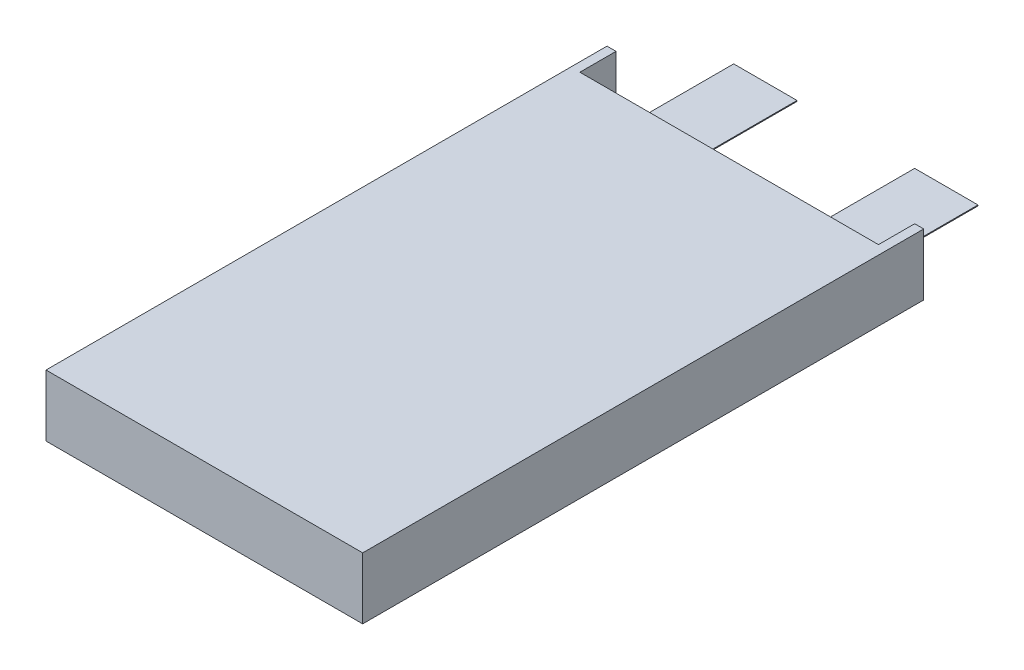
ISO-10303-21;
HEADER;
FILE_DESCRIPTION(('STEP AP214'),'2;1');
FILE_NAME('part.step','',(''),(''),'','','');
FILE_SCHEMA(('AUTOMOTIVE_DESIGN { 1 0 10303 214 1 1 1 1 }'));
ENDSEC;
DATA;
#1=APPLICATION_CONTEXT('core data for automotive mechanical design processes');
#2=APPLICATION_PROTOCOL_DEFINITION('international standard','automotive_design',2000,#1);
#3=PRODUCT_CONTEXT('',#1,'mechanical');
#4=PRODUCT('Part','Part','',(#3));
#5=PRODUCT_RELATED_PRODUCT_CATEGORY('part','',(#4));
#6=PRODUCT_DEFINITION_FORMATION('','',#4);
#7=PRODUCT_DEFINITION_CONTEXT('part definition',#1,'design');
#8=PRODUCT_DEFINITION('design','',#6,#7);
#9=PRODUCT_DEFINITION_SHAPE('','',#8);
#10=(LENGTH_UNIT() NAMED_UNIT(*) SI_UNIT(.MILLI.,.METRE.));
#11=(NAMED_UNIT(*) PLANE_ANGLE_UNIT() SI_UNIT($,.RADIAN.));
#12=(NAMED_UNIT(*) SI_UNIT($,.STERADIAN.) SOLID_ANGLE_UNIT());
#13=UNCERTAINTY_MEASURE_WITH_UNIT(LENGTH_MEASURE(1.E-05),#10,'distance_accuracy_value','');
#14=(GEOMETRIC_REPRESENTATION_CONTEXT(3) GLOBAL_UNCERTAINTY_ASSIGNED_CONTEXT((#13)) GLOBAL_UNIT_ASSIGNED_CONTEXT((#10,
#11,#12)) REPRESENTATION_CONTEXT('',''));
#15=CARTESIAN_POINT('',(0.,0.,0.));
#16=DIRECTION('',(0.,0.,1.));
#17=DIRECTION('',(1.,0.,0.));
#18=AXIS2_PLACEMENT_3D('',#15,#16,#17);
#19=CARTESIAN_POINT('',(6.5,2.,-41.));
#20=DIRECTION('',(1.,0.,0.));
#21=DIRECTION('',(0.,0.,-1.));
#22=AXIS2_PLACEMENT_3D('',#19,#20,#21);
#23=PLANE('',#22);
#24=DIRECTION('',(0.,0.,-1.));
#25=VECTOR('',#24,1.);
#26=CARTESIAN_POINT('',(6.5,2.1,-41.));
#27=LINE('',#26,#25);
#28=CARTESIAN_POINT('',(6.5,2.1,-31.));
#29=VERTEX_POINT('',#28);
#30=CARTESIAN_POINT('',(6.5,2.1,-41.));
#31=VERTEX_POINT('',#30);
#32=EDGE_CURVE('E184',#29,#31,#27,.T.);
#33=ORIENTED_EDGE('',*,*,#32,.T.);
#34=DIRECTION('',(0.,1.,0.));
#35=VECTOR('',#34,1.);
#36=CARTESIAN_POINT('',(6.5,2.1,-41.));
#37=LINE('',#36,#35);
#38=CARTESIAN_POINT('',(6.5,2.,-41.));
#39=VERTEX_POINT('',#38);
#40=EDGE_CURVE('E165',#31,#39,#37,.F.);
#41=ORIENTED_EDGE('',*,*,#40,.T.);
#42=DIRECTION('',(0.,0.,1.));
#43=VECTOR('',#42,1.);
#44=CARTESIAN_POINT('',(6.5,2.,-41.));
#45=LINE('',#44,#43);
#46=CARTESIAN_POINT('',(6.5,2.,-31.));
#47=VERTEX_POINT('',#46);
#48=EDGE_CURVE('E180',#39,#47,#45,.T.);
#49=ORIENTED_EDGE('',*,*,#48,.T.);
#50=DIRECTION('',(0.,1.,0.));
#51=VECTOR('',#50,1.);
#52=CARTESIAN_POINT('',(6.5,2.,-31.));
#53=LINE('',#52,#51);
#54=EDGE_CURVE('E19',#29,#47,#53,.F.);
#55=ORIENTED_EDGE('',*,*,#54,.F.);
#56=EDGE_LOOP('',(#33,#41,#49,#55));
#57=FACE_BOUND('',#56,.T.);
#58=ADVANCED_FACE('F16',(#57),#23,.F.);
#59=CARTESIAN_POINT('',(13.5,2.1,-41.));
#60=DIRECTION('',(0.,0.,1.));
#61=DIRECTION('',(1.,0.,0.));
#62=AXIS2_PLACEMENT_3D('',#59,#60,#61);
#63=PLANE('',#62);
#64=DIRECTION('',(1.,0.,0.));
#65=VECTOR('',#64,1.);
#66=CARTESIAN_POINT('',(13.5,2.,-41.));
#67=LINE('',#66,#65);
#68=CARTESIAN_POINT('',(13.5,2.,-41.));
#69=VERTEX_POINT('',#68);
#70=EDGE_CURVE('E185',#69,#39,#67,.F.);
#71=ORIENTED_EDGE('',*,*,#70,.T.);
#72=ORIENTED_EDGE('',*,*,#40,.F.);
#73=DIRECTION('',(1.,0.,0.));
#74=VECTOR('',#73,1.);
#75=CARTESIAN_POINT('',(13.5,2.1,-41.));
#76=LINE('',#75,#74);
#77=CARTESIAN_POINT('',(13.5,2.1,-41.));
#78=VERTEX_POINT('',#77);
#79=EDGE_CURVE('E243',#31,#78,#76,.T.);
#80=ORIENTED_EDGE('',*,*,#79,.T.);
#81=DIRECTION('',(0.,1.,0.));
#82=VECTOR('',#81,1.);
#83=CARTESIAN_POINT('',(13.5,2.,-41.));
#84=LINE('',#83,#82);
#85=EDGE_CURVE('E164',#78,#69,#84,.F.);
#86=ORIENTED_EDGE('',*,*,#85,.T.);
#87=EDGE_LOOP('',(#71,#72,#80,#86));
#88=FACE_BOUND('',#87,.T.);
#89=ADVANCED_FACE('F438',(#88),#63,.F.);
#90=CARTESIAN_POINT('',(13.5,2.,-41.));
#91=DIRECTION('',(-1.,0.,0.));
#92=DIRECTION('',(0.,0.,1.));
#93=AXIS2_PLACEMENT_3D('',#90,#91,#92);
#94=PLANE('',#93);
#95=DIRECTION('',(0.,0.,1.));
#96=VECTOR('',#95,1.);
#97=CARTESIAN_POINT('',(13.5,2.,-41.));
#98=LINE('',#97,#96);
#99=CARTESIAN_POINT('',(13.5,2.,-31.));
#100=VERTEX_POINT('',#99);
#101=EDGE_CURVE('E190',#100,#69,#98,.F.);
#102=ORIENTED_EDGE('',*,*,#101,.T.);
#103=ORIENTED_EDGE('',*,*,#85,.F.);
#104=DIRECTION('',(0.,0.,-1.));
#105=VECTOR('',#104,1.);
#106=CARTESIAN_POINT('',(13.5,2.1,-41.));
#107=LINE('',#106,#105);
#108=CARTESIAN_POINT('',(13.5,2.1,-31.));
#109=VERTEX_POINT('',#108);
#110=EDGE_CURVE('E240',#78,#109,#107,.F.);
#111=ORIENTED_EDGE('',*,*,#110,.T.);
#112=DIRECTION('',(0.,1.,0.));
#113=VECTOR('',#112,1.);
#114=CARTESIAN_POINT('',(13.5,2.,-31.));
#115=LINE('',#114,#113);
#116=EDGE_CURVE('E162',#100,#109,#115,.T.);
#117=ORIENTED_EDGE('',*,*,#116,.F.);
#118=EDGE_LOOP('',(#102,#103,#111,#117));
#119=FACE_BOUND('',#118,.T.);
#120=ADVANCED_FACE('F429',(#119),#94,.F.);
#121=CARTESIAN_POINT('',(-13.5,2.,-41.));
#122=DIRECTION('',(1.,0.,0.));
#123=DIRECTION('',(0.,0.,-1.));
#124=AXIS2_PLACEMENT_3D('',#121,#122,#123);
#125=PLANE('',#124);
#126=DIRECTION('',(0.,0.,1.));
#127=VECTOR('',#126,1.);
#128=CARTESIAN_POINT('',(-13.5,2.1,-41.));
#129=LINE('',#128,#127);
#130=CARTESIAN_POINT('',(-13.5,2.1,-31.));
#131=VERTEX_POINT('',#130);
#132=CARTESIAN_POINT('',(-13.5,2.1,-41.));
#133=VERTEX_POINT('',#132);
#134=EDGE_CURVE('E228',#131,#133,#129,.F.);
#135=ORIENTED_EDGE('',*,*,#134,.T.);
#136=DIRECTION('',(0.,1.,0.));
#137=VECTOR('',#136,1.);
#138=CARTESIAN_POINT('',(-13.5,2.1,-41.));
#139=LINE('',#138,#137);
#140=CARTESIAN_POINT('',(-13.5,2.,-41.));
#141=VERTEX_POINT('',#140);
#142=EDGE_CURVE('E158',#133,#141,#139,.F.);
#143=ORIENTED_EDGE('',*,*,#142,.T.);
#144=DIRECTION('',(0.,0.,1.));
#145=VECTOR('',#144,1.);
#146=CARTESIAN_POINT('',(-13.5,2.,-41.));
#147=LINE('',#146,#145);
#148=CARTESIAN_POINT('',(-13.5,2.,-31.));
#149=VERTEX_POINT('',#148);
#150=EDGE_CURVE('E231',#141,#149,#147,.T.);
#151=ORIENTED_EDGE('',*,*,#150,.T.);
#152=DIRECTION('',(0.,1.,0.));
#153=VECTOR('',#152,1.);
#154=CARTESIAN_POINT('',(-13.5,2.,-31.));
#155=LINE('',#154,#153);
#156=EDGE_CURVE('E160',#131,#149,#155,.F.);
#157=ORIENTED_EDGE('',*,*,#156,.F.);
#158=EDGE_LOOP('',(#135,#143,#151,#157));
#159=FACE_BOUND('',#158,.T.);
#160=ADVANCED_FACE('F281',(#159),#125,.F.);
#161=CARTESIAN_POINT('',(-6.5,2.1,-41.));
#162=DIRECTION('',(0.,0.,1.));
#163=DIRECTION('',(1.,0.,0.));
#164=AXIS2_PLACEMENT_3D('',#161,#162,#163);
#165=PLANE('',#164);
#166=DIRECTION('',(1.,0.,0.));
#167=VECTOR('',#166,1.);
#168=CARTESIAN_POINT('',(-6.5,2.,-41.));
#169=LINE('',#168,#167);
#170=CARTESIAN_POINT('',(-6.5,2.,-41.));
#171=VERTEX_POINT('',#170);
#172=EDGE_CURVE('E234',#171,#141,#169,.F.);
#173=ORIENTED_EDGE('',*,*,#172,.T.);
#174=ORIENTED_EDGE('',*,*,#142,.F.);
#175=DIRECTION('',(1.,0.,0.));
#176=VECTOR('',#175,1.);
#177=CARTESIAN_POINT('',(-6.5,2.1,-41.));
#178=LINE('',#177,#176);
#179=CARTESIAN_POINT('',(-6.5,2.1,-41.));
#180=VERTEX_POINT('',#179);
#181=EDGE_CURVE('E225',#133,#180,#178,.T.);
#182=ORIENTED_EDGE('',*,*,#181,.T.);
#183=DIRECTION('',(0.,-1.,0.));
#184=VECTOR('',#183,1.);
#185=CARTESIAN_POINT('',(-6.5,2.,-41.));
#186=LINE('',#185,#184);
#187=EDGE_CURVE('E156',#180,#171,#186,.T.);
#188=ORIENTED_EDGE('',*,*,#187,.T.);
#189=EDGE_LOOP('',(#173,#174,#182,#188));
#190=FACE_BOUND('',#189,.T.);
#191=ADVANCED_FACE('F284',(#190),#165,.F.);
#192=CARTESIAN_POINT('',(-6.5,2.,-41.));
#193=DIRECTION('',(-1.,0.,0.));
#194=DIRECTION('',(0.,-1.,0.));
#195=AXIS2_PLACEMENT_3D('',#192,#193,#194);
#196=PLANE('',#195);
#197=DIRECTION('',(0.,0.,1.));
#198=VECTOR('',#197,1.);
#199=CARTESIAN_POINT('',(-6.5,2.,-41.));
#200=LINE('',#199,#198);
#201=CARTESIAN_POINT('',(-6.5,2.,-31.));
#202=VERTEX_POINT('',#201);
#203=EDGE_CURVE('E237',#202,#171,#200,.F.);
#204=ORIENTED_EDGE('',*,*,#203,.T.);
#205=ORIENTED_EDGE('',*,*,#187,.F.);
#206=DIRECTION('',(0.,0.,1.));
#207=VECTOR('',#206,1.);
#208=CARTESIAN_POINT('',(-6.5,2.1,-41.));
#209=LINE('',#208,#207);
#210=CARTESIAN_POINT('',(-6.5,2.1,-31.));
#211=VERTEX_POINT('',#210);
#212=EDGE_CURVE('E222',#180,#211,#209,.T.);
#213=ORIENTED_EDGE('',*,*,#212,.T.);
#214=DIRECTION('',(0.,-1.,0.));
#215=VECTOR('',#214,1.);
#216=CARTESIAN_POINT('',(-6.5,2.,-31.));
#217=LINE('',#216,#215);
#218=EDGE_CURVE('E144',#202,#211,#217,.F.);
#219=ORIENTED_EDGE('',*,*,#218,.F.);
#220=EDGE_LOOP('',(#204,#205,#213,#219));
#221=FACE_BOUND('',#220,.T.);
#222=ADVANCED_FACE('F289',(#221),#196,.F.);
#223=CARTESIAN_POINT('',(-16.5,2.8,-27.));
#224=DIRECTION('',(0.,0.,1.));
#225=DIRECTION('',(1.,0.,0.));
#226=AXIS2_PLACEMENT_3D('',#223,#224,#225);
#227=PLANE('',#226);
#228=DIRECTION('',(0.,1.,0.));
#229=VECTOR('',#228,1.);
#230=CARTESIAN_POINT('',(16.5,2.8,-27.));
#231=LINE('',#230,#229);
#232=CARTESIAN_POINT('',(16.5,6.8,-27.));
#233=VERTEX_POINT('',#232);
#234=CARTESIAN_POINT('',(16.5,2.8,-27.));
#235=VERTEX_POINT('',#234);
#236=EDGE_CURVE('E136',#233,#235,#231,.F.);
#237=ORIENTED_EDGE('',*,*,#236,.T.);
#238=DIRECTION('',(1.,0.,0.));
#239=VECTOR('',#238,1.);
#240=CARTESIAN_POINT('',(-16.5,2.8,-27.));
#241=LINE('',#240,#239);
#242=CARTESIAN_POINT('',(-16.5,2.8,-27.));
#243=VERTEX_POINT('',#242);
#244=EDGE_CURVE('E126',#243,#235,#241,.T.);
#245=ORIENTED_EDGE('',*,*,#244,.F.);
#246=DIRECTION('',(0.,1.,0.));
#247=VECTOR('',#246,1.);
#248=CARTESIAN_POINT('',(-16.5,2.8,-27.));
#249=LINE('',#248,#247);
#250=CARTESIAN_POINT('',(-16.5,6.8,-27.));
#251=VERTEX_POINT('',#250);
#252=EDGE_CURVE('E151',#243,#251,#249,.T.);
#253=ORIENTED_EDGE('',*,*,#252,.T.);
#254=DIRECTION('',(1.,0.,0.));
#255=VECTOR('',#254,1.);
#256=CARTESIAN_POINT('',(-17.5,6.8,-27.));
#257=LINE('',#256,#255);
#258=EDGE_CURVE('E141',#233,#251,#257,.F.);
#259=ORIENTED_EDGE('',*,*,#258,.F.);
#260=EDGE_LOOP('',(#237,#245,#253,#259));
#261=FACE_BOUND('',#260,.T.);
#262=ADVANCED_FACE('F139',(#261),#227,.F.);
#263=CARTESIAN_POINT('',(16.5,2.8,-31.));
#264=DIRECTION('',(1.,0.,0.));
#265=DIRECTION('',(0.,0.,-1.));
#266=AXIS2_PLACEMENT_3D('',#263,#264,#265);
#267=PLANE('',#266);
#268=DIRECTION('',(0.,1.,0.));
#269=VECTOR('',#268,1.);
#270=CARTESIAN_POINT('',(16.5,6.8,-31.));
#271=LINE('',#270,#269);
#272=CARTESIAN_POINT('',(16.5,6.8,-31.));
#273=VERTEX_POINT('',#272);
#274=CARTESIAN_POINT('',(16.5,2.8,-31.));
#275=VERTEX_POINT('',#274);
#276=EDGE_CURVE('E149',#273,#275,#271,.F.);
#277=ORIENTED_EDGE('',*,*,#276,.T.);
#278=DIRECTION('',(0.,0.,1.));
#279=VECTOR('',#278,1.);
#280=CARTESIAN_POINT('',(16.5,2.8,-27.));
#281=LINE('',#280,#279);
#282=EDGE_CURVE('E133',#235,#275,#281,.F.);
#283=ORIENTED_EDGE('',*,*,#282,.F.);
#284=ORIENTED_EDGE('',*,*,#236,.F.);
#285=DIRECTION('',(0.,0.,1.));
#286=VECTOR('',#285,1.);
#287=CARTESIAN_POINT('',(16.5,6.8,-31.));
#288=LINE('',#287,#286);
#289=EDGE_CURVE('E218',#273,#233,#288,.T.);
#290=ORIENTED_EDGE('',*,*,#289,.F.);
#291=EDGE_LOOP('',(#277,#283,#284,#290));
#292=FACE_BOUND('',#291,.T.);
#293=ADVANCED_FACE('F147',(#292),#267,.F.);
#294=CARTESIAN_POINT('',(-16.5,2.8,-27.));
#295=DIRECTION('',(0.,1.,0.));
#296=DIRECTION('',(0.,0.,1.));
#297=AXIS2_PLACEMENT_3D('',#294,#295,#296);
#298=PLANE('',#297);
#299=ORIENTED_EDGE('',*,*,#282,.T.);
#300=DIRECTION('',(1.,0.,0.));
#301=VECTOR('',#300,1.);
#302=CARTESIAN_POINT('',(17.5,2.8,-31.));
#303=LINE('',#302,#301);
#304=CARTESIAN_POINT('',(-16.5,2.8,-31.));
#305=VERTEX_POINT('',#304);
#306=EDGE_CURVE('E201',#275,#305,#303,.F.);
#307=ORIENTED_EDGE('',*,*,#306,.T.);
#308=DIRECTION('',(0.,0.,1.));
#309=VECTOR('',#308,1.);
#310=CARTESIAN_POINT('',(-16.5,2.8,-31.));
#311=LINE('',#310,#309);
#312=EDGE_CURVE('E135',#305,#243,#311,.T.);
#313=ORIENTED_EDGE('',*,*,#312,.T.);
#314=ORIENTED_EDGE('',*,*,#244,.T.);
#315=EDGE_LOOP('',(#299,#307,#313,#314));
#316=FACE_BOUND('',#315,.T.);
#317=ADVANCED_FACE('F130',(#316),#298,.T.);
#318=CARTESIAN_POINT('',(-16.5,2.8,-31.));
#319=DIRECTION('',(-1.,0.,0.));
#320=DIRECTION('',(0.,0.,1.));
#321=AXIS2_PLACEMENT_3D('',#318,#319,#320);
#322=PLANE('',#321);
#323=ORIENTED_EDGE('',*,*,#252,.F.);
#324=ORIENTED_EDGE('',*,*,#312,.F.);
#325=DIRECTION('',(0.,1.,0.));
#326=VECTOR('',#325,1.);
#327=CARTESIAN_POINT('',(-16.5,6.8,-31.));
#328=LINE('',#327,#326);
#329=CARTESIAN_POINT('',(-16.5,6.8,-31.));
#330=VERTEX_POINT('',#329);
#331=EDGE_CURVE('E195',#305,#330,#328,.T.);
#332=ORIENTED_EDGE('',*,*,#331,.T.);
#333=DIRECTION('',(0.,0.,1.));
#334=VECTOR('',#333,1.);
#335=CARTESIAN_POINT('',(-16.5,6.8,-31.));
#336=LINE('',#335,#334);
#337=EDGE_CURVE('E220',#251,#330,#336,.F.);
#338=ORIENTED_EDGE('',*,*,#337,.F.);
#339=EDGE_LOOP('',(#323,#324,#332,#338));
#340=FACE_BOUND('',#339,.T.);
#341=ADVANCED_FACE('F253',(#340),#322,.F.);
#342=CARTESIAN_POINT('',(13.5,2.,-41.));
#343=DIRECTION('',(0.,1.,0.));
#344=DIRECTION('',(0.,0.,1.));
#345=AXIS2_PLACEMENT_3D('',#342,#343,#344);
#346=PLANE('',#345);
#347=ORIENTED_EDGE('',*,*,#48,.F.);
#348=ORIENTED_EDGE('',*,*,#70,.F.);
#349=ORIENTED_EDGE('',*,*,#101,.F.);
#350=DIRECTION('',(1.,0.,0.));
#351=VECTOR('',#350,1.);
#352=CARTESIAN_POINT('',(17.5,2.,-31.));
#353=LINE('',#352,#351);
#354=EDGE_CURVE('E176',#100,#47,#353,.F.);
#355=ORIENTED_EDGE('',*,*,#354,.T.);
#356=EDGE_LOOP('',(#347,#348,#349,#355));
#357=FACE_BOUND('',#356,.T.);
#358=ADVANCED_FACE('F188',(#357),#346,.F.);
#359=CARTESIAN_POINT('',(13.5,2.1,-41.));
#360=DIRECTION('',(0.,-1.,0.));
#361=DIRECTION('',(0.,0.,-1.));
#362=AXIS2_PLACEMENT_3D('',#359,#360,#361);
#363=PLANE('',#362);
#364=ORIENTED_EDGE('',*,*,#110,.F.);
#365=ORIENTED_EDGE('',*,*,#79,.F.);
#366=ORIENTED_EDGE('',*,*,#32,.F.);
#367=DIRECTION('',(1.,0.,0.));
#368=VECTOR('',#367,1.);
#369=CARTESIAN_POINT('',(17.5,2.1,-31.));
#370=LINE('',#369,#368);
#371=EDGE_CURVE('E178',#29,#109,#370,.T.);
#372=ORIENTED_EDGE('',*,*,#371,.T.);
#373=EDGE_LOOP('',(#364,#365,#366,#372));
#374=FACE_BOUND('',#373,.T.);
#375=ADVANCED_FACE('F327',(#374),#363,.F.);
#376=CARTESIAN_POINT('',(-6.5,2.,-41.));
#377=DIRECTION('',(0.,1.,0.));
#378=DIRECTION('',(0.,0.,1.));
#379=AXIS2_PLACEMENT_3D('',#376,#377,#378);
#380=PLANE('',#379);
#381=ORIENTED_EDGE('',*,*,#150,.F.);
#382=ORIENTED_EDGE('',*,*,#172,.F.);
#383=ORIENTED_EDGE('',*,*,#203,.F.);
#384=DIRECTION('',(1.,0.,0.));
#385=VECTOR('',#384,1.);
#386=CARTESIAN_POINT('',(17.5,2.,-31.));
#387=LINE('',#386,#385);
#388=EDGE_CURVE('E193',#202,#149,#387,.F.);
#389=ORIENTED_EDGE('',*,*,#388,.T.);
#390=EDGE_LOOP('',(#381,#382,#383,#389));
#391=FACE_BOUND('',#390,.T.);
#392=ADVANCED_FACE('F275',(#391),#380,.F.);
#393=CARTESIAN_POINT('',(-6.5,2.1,-41.));
#394=DIRECTION('',(0.,-1.,0.));
#395=DIRECTION('',(1.,0.,0.));
#396=AXIS2_PLACEMENT_3D('',#393,#394,#395);
#397=PLANE('',#396);
#398=ORIENTED_EDGE('',*,*,#212,.F.);
#399=ORIENTED_EDGE('',*,*,#181,.F.);
#400=ORIENTED_EDGE('',*,*,#134,.F.);
#401=DIRECTION('',(1.,0.,0.));
#402=VECTOR('',#401,1.);
#403=CARTESIAN_POINT('',(17.5,2.1,-31.));
#404=LINE('',#403,#402);
#405=EDGE_CURVE('E265',#131,#211,#404,.T.);
#406=ORIENTED_EDGE('',*,*,#405,.T.);
#407=EDGE_LOOP('',(#398,#399,#400,#406));
#408=FACE_BOUND('',#407,.T.);
#409=ADVANCED_FACE('F287',(#408),#397,.F.);
#410=CARTESIAN_POINT('',(-17.5,6.8,-31.));
#411=DIRECTION('',(0.,1.,0.));
#412=DIRECTION('',(0.,0.,1.));
#413=AXIS2_PLACEMENT_3D('',#410,#411,#412);
#414=PLANE('',#413);
#415=ORIENTED_EDGE('',*,*,#289,.T.);
#416=ORIENTED_EDGE('',*,*,#258,.T.);
#417=ORIENTED_EDGE('',*,*,#337,.T.);
#418=DIRECTION('',(1.,0.,0.));
#419=VECTOR('',#418,1.);
#420=CARTESIAN_POINT('',(17.5,6.8,-31.));
#421=LINE('',#420,#419);
#422=CARTESIAN_POINT('',(-17.5,6.8,-31.));
#423=VERTEX_POINT('',#422);
#424=EDGE_CURVE('E191',#330,#423,#421,.F.);
#425=ORIENTED_EDGE('',*,*,#424,.T.);
#426=DIRECTION('',(0.,0.,-1.));
#427=VECTOR('',#426,1.);
#428=CARTESIAN_POINT('',(-17.5,6.8,31.));
#429=LINE('',#428,#427);
#430=CARTESIAN_POINT('',(-17.5,6.8,31.));
#431=VERTEX_POINT('',#430);
#432=EDGE_CURVE('E257',#423,#431,#429,.F.);
#433=ORIENTED_EDGE('',*,*,#432,.T.);
#434=DIRECTION('',(-1.,0.,0.));
#435=VECTOR('',#434,1.);
#436=CARTESIAN_POINT('',(17.5,6.8,31.));
#437=LINE('',#436,#435);
#438=CARTESIAN_POINT('',(17.5,6.8,31.));
#439=VERTEX_POINT('',#438);
#440=EDGE_CURVE('E215',#431,#439,#437,.F.);
#441=ORIENTED_EDGE('',*,*,#440,.T.);
#442=DIRECTION('',(0.,0.,1.));
#443=VECTOR('',#442,1.);
#444=CARTESIAN_POINT('',(17.5,6.8,31.));
#445=LINE('',#444,#443);
#446=CARTESIAN_POINT('',(17.5,6.8,-31.));
#447=VERTEX_POINT('',#446);
#448=EDGE_CURVE('E210',#439,#447,#445,.F.);
#449=ORIENTED_EDGE('',*,*,#448,.T.);
#450=DIRECTION('',(1.,0.,0.));
#451=VECTOR('',#450,1.);
#452=CARTESIAN_POINT('',(17.5,6.8,-31.));
#453=LINE('',#452,#451);
#454=EDGE_CURVE('E204',#447,#273,#453,.F.);
#455=ORIENTED_EDGE('',*,*,#454,.T.);
#456=EDGE_LOOP('',(#415,#416,#417,#425,#433,#441,#449,#455));
#457=FACE_BOUND('',#456,.T.);
#458=ADVANCED_FACE('F251',(#457),#414,.T.);
#459=CARTESIAN_POINT('',(17.5,6.8,31.));
#460=DIRECTION('',(0.,0.,-1.));
#461=DIRECTION('',(-1.,0.,0.));
#462=AXIS2_PLACEMENT_3D('',#459,#460,#461);
#463=PLANE('',#462);
#464=DIRECTION('',(0.,1.,0.));
#465=VECTOR('',#464,1.);
#466=CARTESIAN_POINT('',(17.5,6.8,31.));
#467=LINE('',#466,#465);
#468=CARTESIAN_POINT('',(17.5,0.,31.));
#469=VERTEX_POINT('',#468);
#470=EDGE_CURVE('E212',#469,#439,#467,.T.);
#471=ORIENTED_EDGE('',*,*,#470,.T.);
#472=ORIENTED_EDGE('',*,*,#440,.F.);
#473=DIRECTION('',(0.,1.,0.));
#474=VECTOR('',#473,1.);
#475=CARTESIAN_POINT('',(-17.5,6.8,31.));
#476=LINE('',#475,#474);
#477=CARTESIAN_POINT('',(-17.5,0.,31.));
#478=VERTEX_POINT('',#477);
#479=EDGE_CURVE('E261',#431,#478,#476,.F.);
#480=ORIENTED_EDGE('',*,*,#479,.T.);
#481=DIRECTION('',(1.,0.,0.));
#482=VECTOR('',#481,1.);
#483=CARTESIAN_POINT('',(-17.5,0.,31.));
#484=LINE('',#483,#482);
#485=EDGE_CURVE('E263',#478,#469,#484,.T.);
#486=ORIENTED_EDGE('',*,*,#485,.T.);
#487=EDGE_LOOP('',(#471,#472,#480,#486));
#488=FACE_BOUND('',#487,.T.);
#489=ADVANCED_FACE('F316',(#488),#463,.F.);
#490=CARTESIAN_POINT('',(17.5,6.8,31.));
#491=DIRECTION('',(-1.,0.,0.));
#492=DIRECTION('',(0.,0.,1.));
#493=AXIS2_PLACEMENT_3D('',#490,#491,#492);
#494=PLANE('',#493);
#495=DIRECTION('',(0.,1.,0.));
#496=VECTOR('',#495,1.);
#497=CARTESIAN_POINT('',(17.5,6.8,-31.));
#498=LINE('',#497,#496);
#499=CARTESIAN_POINT('',(17.5,0.,-31.));
#500=VERTEX_POINT('',#499);
#501=EDGE_CURVE('E207',#500,#447,#498,.T.);
#502=ORIENTED_EDGE('',*,*,#501,.T.);
#503=ORIENTED_EDGE('',*,*,#448,.F.);
#504=ORIENTED_EDGE('',*,*,#470,.F.);
#505=DIRECTION('',(0.,0.,1.));
#506=VECTOR('',#505,1.);
#507=CARTESIAN_POINT('',(17.5,0.,-31.));
#508=LINE('',#507,#506);
#509=EDGE_CURVE('E475',#469,#500,#508,.F.);
#510=ORIENTED_EDGE('',*,*,#509,.T.);
#511=EDGE_LOOP('',(#502,#503,#504,#510));
#512=FACE_BOUND('',#511,.T.);
#513=ADVANCED_FACE('F313',(#512),#494,.F.);
#514=CARTESIAN_POINT('',(17.5,6.8,-31.));
#515=DIRECTION('',(0.,0.,1.));
#516=DIRECTION('',(1.,0.,0.));
#517=AXIS2_PLACEMENT_3D('',#514,#515,#516);
#518=PLANE('',#517);
#519=ORIENTED_EDGE('',*,*,#405,.F.);
#520=ORIENTED_EDGE('',*,*,#156,.T.);
#521=ORIENTED_EDGE('',*,*,#388,.F.);
#522=ORIENTED_EDGE('',*,*,#218,.T.);
#523=EDGE_LOOP('',(#519,#520,#521,#522));
#524=FACE_BOUND('',#523,.T.);
#525=ORIENTED_EDGE('',*,*,#371,.F.);
#526=ORIENTED_EDGE('',*,*,#54,.T.);
#527=ORIENTED_EDGE('',*,*,#354,.F.);
#528=ORIENTED_EDGE('',*,*,#116,.T.);
#529=EDGE_LOOP('',(#525,#526,#527,#528));
#530=FACE_BOUND('',#529,.T.);
#531=ORIENTED_EDGE('',*,*,#331,.F.);
#532=ORIENTED_EDGE('',*,*,#306,.F.);
#533=ORIENTED_EDGE('',*,*,#276,.F.);
#534=ORIENTED_EDGE('',*,*,#454,.F.);
#535=ORIENTED_EDGE('',*,*,#501,.F.);
#536=DIRECTION('',(1.,0.,0.));
#537=VECTOR('',#536,1.);
#538=CARTESIAN_POINT('',(-17.5,0.,-31.));
#539=LINE('',#538,#537);
#540=CARTESIAN_POINT('',(-17.5,0.,-31.));
#541=VERTEX_POINT('',#540);
#542=EDGE_CURVE('E25',#500,#541,#539,.F.);
#543=ORIENTED_EDGE('',*,*,#542,.T.);
#544=DIRECTION('',(0.,1.,0.));
#545=VECTOR('',#544,1.);
#546=CARTESIAN_POINT('',(-17.5,6.8,-31.));
#547=LINE('',#546,#545);
#548=EDGE_CURVE('E33',#541,#423,#547,.T.);
#549=ORIENTED_EDGE('',*,*,#548,.T.);
#550=ORIENTED_EDGE('',*,*,#424,.F.);
#551=EDGE_LOOP('',(#531,#532,#533,#534,#535,#543,#549,#550));
#552=FACE_BOUND('',#551,.T.);
#553=ADVANCED_FACE('F173',(#524,#530,#552),#518,.F.);
#554=CARTESIAN_POINT('',(-17.5,6.8,31.));
#555=DIRECTION('',(1.,0.,0.));
#556=DIRECTION('',(0.,0.,-1.));
#557=AXIS2_PLACEMENT_3D('',#554,#555,#556);
#558=PLANE('',#557);
#559=ORIENTED_EDGE('',*,*,#479,.F.);
#560=ORIENTED_EDGE('',*,*,#432,.F.);
#561=ORIENTED_EDGE('',*,*,#548,.F.);
#562=DIRECTION('',(0.,0.,1.));
#563=VECTOR('',#562,1.);
#564=CARTESIAN_POINT('',(-17.5,0.,-31.));
#565=LINE('',#564,#563);
#566=EDGE_CURVE('E11',#541,#478,#565,.T.);
#567=ORIENTED_EDGE('',*,*,#566,.T.);
#568=EDGE_LOOP('',(#559,#560,#561,#567));
#569=FACE_BOUND('',#568,.T.);
#570=ADVANCED_FACE('F259',(#569),#558,.F.);
#571=CARTESIAN_POINT('',(-17.5,0.,-31.));
#572=DIRECTION('',(0.,1.,0.));
#573=DIRECTION('',(0.,0.,1.));
#574=AXIS2_PLACEMENT_3D('',#571,#572,#573);
#575=PLANE('',#574);
#576=ORIENTED_EDGE('',*,*,#542,.F.);
#577=ORIENTED_EDGE('',*,*,#509,.F.);
#578=ORIENTED_EDGE('',*,*,#485,.F.);
#579=ORIENTED_EDGE('',*,*,#566,.F.);
#580=EDGE_LOOP('',(#576,#577,#578,#579));
#581=FACE_BOUND('',#580,.T.);
#582=ADVANCED_FACE('F300',(#581),#575,.F.);
#583=CLOSED_SHELL('',(#58,#89,#120,#160,#191,#222,#262,#293,#317,#341,#358,#375,#392,#409,#458,
#489,#513,#553,#570,#582));
#584=MANIFOLD_SOLID_BREP('B1',#583);
#585=ADVANCED_BREP_SHAPE_REPRESENTATION('',(#18,#584),#14);
#586=SHAPE_DEFINITION_REPRESENTATION(#9,#585);
ENDSEC;
END-ISO-10303-21;
